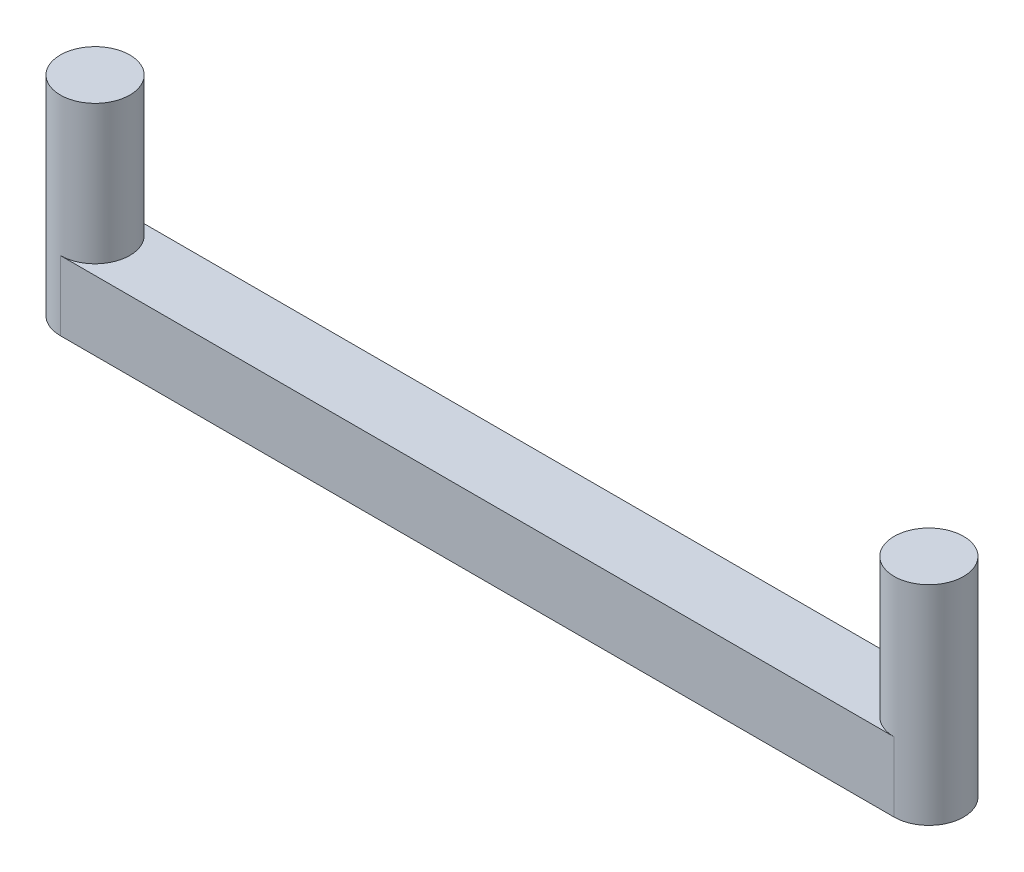
ISO-10303-21;
HEADER;
FILE_DESCRIPTION(('STEP AP214'),'2;1');
FILE_NAME('part.step','',(''),(''),'','','');
FILE_SCHEMA(('AUTOMOTIVE_DESIGN { 1 0 10303 214 1 1 1 1 }'));
ENDSEC;
DATA;
#1=APPLICATION_CONTEXT('core data for automotive mechanical design processes');
#2=APPLICATION_PROTOCOL_DEFINITION('international standard','automotive_design',2000,#1);
#3=PRODUCT_CONTEXT('',#1,'mechanical');
#4=PRODUCT('Part','Part','',(#3));
#5=PRODUCT_RELATED_PRODUCT_CATEGORY('part','',(#4));
#6=PRODUCT_DEFINITION_FORMATION('','',#4);
#7=PRODUCT_DEFINITION_CONTEXT('part definition',#1,'design');
#8=PRODUCT_DEFINITION('design','',#6,#7);
#9=PRODUCT_DEFINITION_SHAPE('','',#8);
#10=(LENGTH_UNIT() NAMED_UNIT(*) SI_UNIT(.MILLI.,.METRE.));
#11=(NAMED_UNIT(*) PLANE_ANGLE_UNIT() SI_UNIT($,.RADIAN.));
#12=(NAMED_UNIT(*) SI_UNIT($,.STERADIAN.) SOLID_ANGLE_UNIT());
#13=UNCERTAINTY_MEASURE_WITH_UNIT(LENGTH_MEASURE(1.E-05),#10,'distance_accuracy_value','');
#14=(GEOMETRIC_REPRESENTATION_CONTEXT(3) GLOBAL_UNCERTAINTY_ASSIGNED_CONTEXT((#13)) GLOBAL_UNIT_ASSIGNED_CONTEXT((#10,
#11,#12)) REPRESENTATION_CONTEXT('',''));
#15=CARTESIAN_POINT('',(0.,0.,0.));
#16=DIRECTION('',(0.,0.,1.));
#17=DIRECTION('',(1.,0.,0.));
#18=AXIS2_PLACEMENT_3D('',#15,#16,#17);
#19=CARTESIAN_POINT('',(-60.,10.,39.2075325808206));
#20=DIRECTION('',(0.,-1.,0.));
#21=DIRECTION('',(0.,0.,-1.));
#22=AXIS2_PLACEMENT_3D('',#19,#20,#21);
#23=CYLINDRICAL_SURFACE('',#22,5.);
#24=CARTESIAN_POINT('',(-60.,0.,39.2075325808206));
#25=DIRECTION('',(0.,1.,0.));
#26=DIRECTION('',(0.,0.,1.));
#27=AXIS2_PLACEMENT_3D('',#24,#25,#26);
#28=CIRCLE('',#27,5.);
#29=CARTESIAN_POINT('',(-60.,0.,34.2075325808206));
#30=VERTEX_POINT('',#29);
#31=CARTESIAN_POINT('',(-60.,0.,44.2075325808206));
#32=VERTEX_POINT('',#31);
#33=EDGE_CURVE('E100',#30,#32,#28,.T.);
#34=ORIENTED_EDGE('',*,*,#33,.T.);
#35=DIRECTION('',(0.,-1.,0.));
#36=VECTOR('',#35,1.);
#37=CARTESIAN_POINT('',(-60.,10.,44.2075325808206));
#38=LINE('',#37,#36);
#39=CARTESIAN_POINT('',(-60.,10.,44.2075325808206));
#40=VERTEX_POINT('',#39);
#41=EDGE_CURVE('E48',#40,#32,#38,.T.);
#42=ORIENTED_EDGE('',*,*,#41,.F.);
#43=CARTESIAN_POINT('',(-60.,10.,39.2075325808206));
#44=DIRECTION('',(0.,1.,0.));
#45=DIRECTION('',(0.,0.,1.));
#46=AXIS2_PLACEMENT_3D('',#43,#44,#45);
#47=CIRCLE('',#46,5.);
#48=CARTESIAN_POINT('',(-60.,10.,34.2075325808206));
#49=VERTEX_POINT('',#48);
#50=EDGE_CURVE('E101',#40,#49,#47,.T.);
#51=ORIENTED_EDGE('',*,*,#50,.T.);
#52=DIRECTION('',(0.,-1.,0.));
#53=VECTOR('',#52,1.);
#54=CARTESIAN_POINT('',(-60.,10.,34.2075325808206));
#55=LINE('',#54,#53);
#56=EDGE_CURVE('E88',#49,#30,#55,.T.);
#57=ORIENTED_EDGE('',*,*,#56,.T.);
#58=EDGE_LOOP('',(#34,#42,#51,#57));
#59=FACE_BOUND('',#58,.T.);
#60=CARTESIAN_POINT('',(-60.,30.,39.2075325808206));
#61=DIRECTION('',(0.,1.,0.));
#62=DIRECTION('',(0.,0.,1.));
#63=AXIS2_PLACEMENT_3D('',#60,#61,#62);
#64=CIRCLE('',#63,5.);
#65=CARTESIAN_POINT('',(-60.,30.,44.2075325808206));
#66=VERTEX_POINT('',#65);
#67=EDGE_CURVE('E211',#66,#66,#64,.T.);
#68=ORIENTED_EDGE('',*,*,#67,.F.);
#69=EDGE_LOOP('',(#68));
#70=FACE_BOUND('',#69,.T.);
#71=ADVANCED_FACE('F45',(#59,#70),#23,.T.);
#72=CARTESIAN_POINT('',(-60.,10.,44.2075325808206));
#73=DIRECTION('',(0.,0.,-1.));
#74=DIRECTION('',(-1.,0.,0.));
#75=AXIS2_PLACEMENT_3D('',#72,#73,#74);
#76=PLANE('',#75);
#77=DIRECTION('',(1.,0.,0.));
#78=VECTOR('',#77,1.);
#79=CARTESIAN_POINT('',(-60.,0.,44.2075325808206));
#80=LINE('',#79,#78);
#81=CARTESIAN_POINT('',(60.,0.,44.2075325808206));
#82=VERTEX_POINT('',#81);
#83=EDGE_CURVE('E105',#32,#82,#80,.T.);
#84=ORIENTED_EDGE('',*,*,#83,.T.);
#85=DIRECTION('',(0.,-1.,0.));
#86=VECTOR('',#85,1.);
#87=CARTESIAN_POINT('',(60.,10.,44.2075325808206));
#88=LINE('',#87,#86);
#89=CARTESIAN_POINT('',(60.,10.,44.2075325808206));
#90=VERTEX_POINT('',#89);
#91=EDGE_CURVE('E121',#90,#82,#88,.T.);
#92=ORIENTED_EDGE('',*,*,#91,.F.);
#93=DIRECTION('',(1.,0.,0.));
#94=VECTOR('',#93,1.);
#95=CARTESIAN_POINT('',(-60.,10.,44.2075325808206));
#96=LINE('',#95,#94);
#97=EDGE_CURVE('E94',#40,#90,#96,.T.);
#98=ORIENTED_EDGE('',*,*,#97,.F.);
#99=ORIENTED_EDGE('',*,*,#41,.T.);
#100=EDGE_LOOP('',(#84,#92,#98,#99));
#101=FACE_BOUND('',#100,.T.);
#102=ADVANCED_FACE('F127',(#101),#76,.F.);
#103=CARTESIAN_POINT('',(60.,10.,39.2075325808206));
#104=DIRECTION('',(0.,-1.,0.));
#105=DIRECTION('',(0.,0.,-1.));
#106=AXIS2_PLACEMENT_3D('',#103,#104,#105);
#107=CYLINDRICAL_SURFACE('',#106,5.);
#108=CARTESIAN_POINT('',(60.,0.,39.2075325808206));
#109=DIRECTION('',(0.,1.,0.));
#110=DIRECTION('',(0.,0.,1.));
#111=AXIS2_PLACEMENT_3D('',#108,#109,#110);
#112=CIRCLE('',#111,5.);
#113=CARTESIAN_POINT('',(60.,0.,34.2075325808206));
#114=VERTEX_POINT('',#113);
#115=EDGE_CURVE('E80',#82,#114,#112,.T.);
#116=ORIENTED_EDGE('',*,*,#115,.T.);
#117=DIRECTION('',(0.,-1.,0.));
#118=VECTOR('',#117,1.);
#119=CARTESIAN_POINT('',(60.,10.,34.2075325808206));
#120=LINE('',#119,#118);
#121=CARTESIAN_POINT('',(60.,10.,34.2075325808206));
#122=VERTEX_POINT('',#121);
#123=EDGE_CURVE('E90',#122,#114,#120,.T.);
#124=ORIENTED_EDGE('',*,*,#123,.F.);
#125=CARTESIAN_POINT('',(60.,10.,39.2075325808206));
#126=DIRECTION('',(0.,1.,0.));
#127=DIRECTION('',(0.,0.,1.));
#128=AXIS2_PLACEMENT_3D('',#125,#126,#127);
#129=CIRCLE('',#128,5.);
#130=EDGE_CURVE('E11',#122,#90,#129,.T.);
#131=ORIENTED_EDGE('',*,*,#130,.T.);
#132=ORIENTED_EDGE('',*,*,#91,.T.);
#133=EDGE_LOOP('',(#116,#124,#131,#132));
#134=FACE_BOUND('',#133,.T.);
#135=CARTESIAN_POINT('',(60.,30.,39.2075325808206));
#136=DIRECTION('',(0.,1.,0.));
#137=DIRECTION('',(0.,0.,1.));
#138=AXIS2_PLACEMENT_3D('',#135,#136,#137);
#139=CIRCLE('',#138,5.);
#140=CARTESIAN_POINT('',(60.,30.,44.2075325808206));
#141=VERTEX_POINT('',#140);
#142=EDGE_CURVE('E108',#141,#141,#139,.T.);
#143=ORIENTED_EDGE('',*,*,#142,.F.);
#144=EDGE_LOOP('',(#143));
#145=FACE_BOUND('',#144,.T.);
#146=ADVANCED_FACE('F133',(#134,#145),#107,.T.);
#147=CARTESIAN_POINT('',(-60.,10.,34.2075325808206));
#148=DIRECTION('',(0.,0.,1.));
#149=DIRECTION('',(1.,0.,0.));
#150=AXIS2_PLACEMENT_3D('',#147,#148,#149);
#151=PLANE('',#150);
#152=DIRECTION('',(-1.,0.,0.));
#153=VECTOR('',#152,1.);
#154=CARTESIAN_POINT('',(-60.,0.,34.2075325808206));
#155=LINE('',#154,#153);
#156=EDGE_CURVE('E85',#114,#30,#155,.T.);
#157=ORIENTED_EDGE('',*,*,#156,.T.);
#158=ORIENTED_EDGE('',*,*,#56,.F.);
#159=DIRECTION('',(-1.,0.,0.));
#160=VECTOR('',#159,1.);
#161=CARTESIAN_POINT('',(-60.,10.,34.2075325808206));
#162=LINE('',#161,#160);
#163=EDGE_CURVE('E63',#122,#49,#162,.T.);
#164=ORIENTED_EDGE('',*,*,#163,.F.);
#165=ORIENTED_EDGE('',*,*,#123,.T.);
#166=EDGE_LOOP('',(#157,#158,#164,#165));
#167=FACE_BOUND('',#166,.T.);
#168=ADVANCED_FACE('F87',(#167),#151,.F.);
#169=CARTESIAN_POINT('',(-60.,10.,39.2075325808206));
#170=DIRECTION('',(0.,1.,0.));
#171=DIRECTION('',(0.,0.,1.));
#172=AXIS2_PLACEMENT_3D('',#169,#170,#171);
#173=PLANE('',#172);
#174=ORIENTED_EDGE('',*,*,#130,.F.);
#175=ORIENTED_EDGE('',*,*,#163,.T.);
#176=ORIENTED_EDGE('',*,*,#50,.F.);
#177=ORIENTED_EDGE('',*,*,#97,.T.);
#178=EDGE_LOOP('',(#174,#175,#176,#177));
#179=FACE_BOUND('',#178,.T.);
#180=ADVANCED_FACE('F131',(#179),#173,.T.);
#181=CARTESIAN_POINT('',(-60.,0.,39.2075325808206));
#182=DIRECTION('',(0.,1.,0.));
#183=DIRECTION('',(0.,0.,1.));
#184=AXIS2_PLACEMENT_3D('',#181,#182,#183);
#185=PLANE('',#184);
#186=ORIENTED_EDGE('',*,*,#33,.F.);
#187=ORIENTED_EDGE('',*,*,#156,.F.);
#188=ORIENTED_EDGE('',*,*,#115,.F.);
#189=ORIENTED_EDGE('',*,*,#83,.F.);
#190=EDGE_LOOP('',(#186,#187,#188,#189));
#191=FACE_BOUND('',#190,.T.);
#192=ADVANCED_FACE('F104',(#191),#185,.F.);
#193=CARTESIAN_POINT('',(-60.,30.,39.2075325808206));
#194=DIRECTION('',(0.,1.,0.));
#195=DIRECTION('',(0.,0.,1.));
#196=AXIS2_PLACEMENT_3D('',#193,#194,#195);
#197=PLANE('',#196);
#198=ORIENTED_EDGE('',*,*,#67,.T.);
#199=EDGE_LOOP('',(#198));
#200=FACE_BOUND('',#199,.T.);
#201=ADVANCED_FACE('F142',(#200),#197,.T.);
#202=CARTESIAN_POINT('',(60.,30.,39.2075325808206));
#203=DIRECTION('',(0.,1.,0.));
#204=DIRECTION('',(0.,0.,1.));
#205=AXIS2_PLACEMENT_3D('',#202,#203,#204);
#206=PLANE('',#205);
#207=ORIENTED_EDGE('',*,*,#142,.T.);
#208=EDGE_LOOP('',(#207));
#209=FACE_BOUND('',#208,.T.);
#210=ADVANCED_FACE('F140',(#209),#206,.T.);
#211=CLOSED_SHELL('',(#71,#102,#146,#168,#180,#192,#201,#210));
#212=MANIFOLD_SOLID_BREP('B2',#211);
#213=ADVANCED_BREP_SHAPE_REPRESENTATION('',(#18,#212),#14);
#214=SHAPE_DEFINITION_REPRESENTATION(#9,#213);
ENDSEC;
END-ISO-10303-21;
